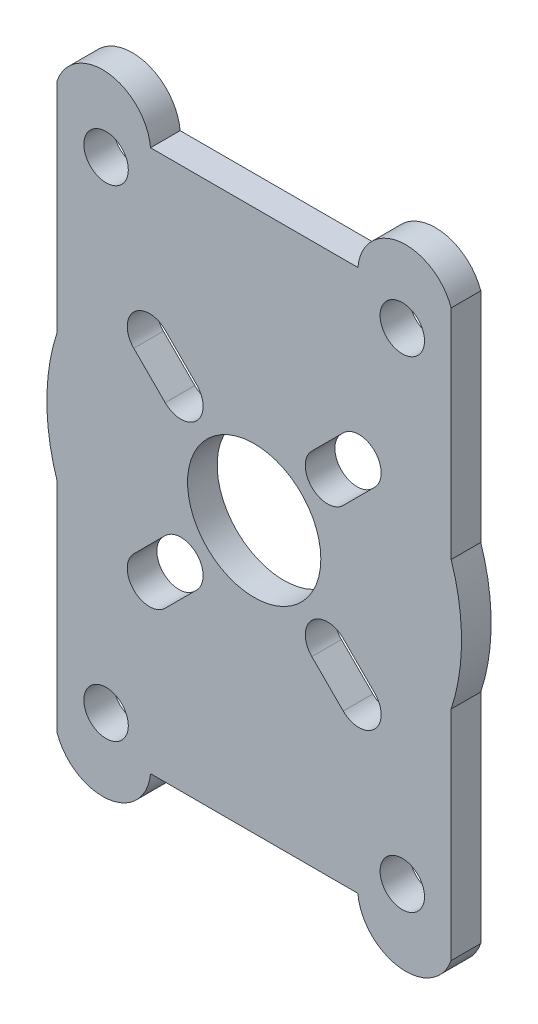
ISO-10303-21;
HEADER;
FILE_DESCRIPTION(('STEP AP214'),'2;1');
FILE_NAME('part.step','',(''),(''),'','','');
FILE_SCHEMA(('AUTOMOTIVE_DESIGN { 1 0 10303 214 1 1 1 1 }'));
ENDSEC;
DATA;
#1=APPLICATION_CONTEXT('core data for automotive mechanical design processes');
#2=APPLICATION_PROTOCOL_DEFINITION('international standard','automotive_design',2000,#1);
#3=PRODUCT_CONTEXT('',#1,'mechanical');
#4=PRODUCT('Part','Part','',(#3));
#5=PRODUCT_RELATED_PRODUCT_CATEGORY('part','',(#4));
#6=PRODUCT_DEFINITION_FORMATION('','',#4);
#7=PRODUCT_DEFINITION_CONTEXT('part definition',#1,'design');
#8=PRODUCT_DEFINITION('design','',#6,#7);
#9=PRODUCT_DEFINITION_SHAPE('','',#8);
#10=(LENGTH_UNIT() NAMED_UNIT(*) SI_UNIT(.MILLI.,.METRE.));
#11=(NAMED_UNIT(*) PLANE_ANGLE_UNIT() SI_UNIT($,.RADIAN.));
#12=(NAMED_UNIT(*) SI_UNIT($,.STERADIAN.) SOLID_ANGLE_UNIT());
#13=UNCERTAINTY_MEASURE_WITH_UNIT(LENGTH_MEASURE(1.E-05),#10,'distance_accuracy_value','');
#14=(GEOMETRIC_REPRESENTATION_CONTEXT(3) GLOBAL_UNCERTAINTY_ASSIGNED_CONTEXT((#13)) GLOBAL_UNIT_ASSIGNED_CONTEXT((#10,
#11,#12)) REPRESENTATION_CONTEXT('',''));
#15=CARTESIAN_POINT('',(0.,0.,0.));
#16=DIRECTION('',(0.,0.,1.));
#17=DIRECTION('',(1.,0.,0.));
#18=AXIS2_PLACEMENT_3D('',#15,#16,#17);
#19=CARTESIAN_POINT('',(10.2361242250569,18.,2.));
#20=DIRECTION('',(0.,0.,-1.));
#21=DIRECTION('',(-1.,0.,0.));
#22=AXIS2_PLACEMENT_3D('',#19,#20,#21);
#23=CYLINDRICAL_SURFACE('',#22,3.25);
#24=CARTESIAN_POINT('',(10.2361242250569,18.,0.));
#25=DIRECTION('',(0.,0.,1.));
#26=DIRECTION('',(-1.,0.,0.));
#27=AXIS2_PLACEMENT_3D('',#24,#25,#26);
#28=CIRCLE('',#27,3.25);
#29=CARTESIAN_POINT('',(13.3,19.0840503843072,0.));
#30=VERTEX_POINT('',#29);
#31=CARTESIAN_POINT('',(7.,18.3,0.));
#32=VERTEX_POINT('',#31);
#33=EDGE_CURVE('E377',#30,#32,#28,.T.);
#34=ORIENTED_EDGE('',*,*,#33,.T.);
#35=DIRECTION('',(0.,0.,-1.));
#36=VECTOR('',#35,1.);
#37=CARTESIAN_POINT('',(7.,18.3,2.));
#38=LINE('',#37,#36);
#39=CARTESIAN_POINT('',(7.,18.3,2.));
#40=VERTEX_POINT('',#39);
#41=EDGE_CURVE('E39',#40,#32,#38,.T.);
#42=ORIENTED_EDGE('',*,*,#41,.F.);
#43=CARTESIAN_POINT('',(10.2361242250569,18.,2.));
#44=DIRECTION('',(0.,0.,1.));
#45=DIRECTION('',(-1.,0.,0.));
#46=AXIS2_PLACEMENT_3D('',#43,#44,#45);
#47=CIRCLE('',#46,3.25);
#48=CARTESIAN_POINT('',(13.3,19.0840503843072,2.));
#49=VERTEX_POINT('',#48);
#50=EDGE_CURVE('E383',#49,#40,#47,.T.);
#51=ORIENTED_EDGE('',*,*,#50,.F.);
#52=DIRECTION('',(0.,0.,-1.));
#53=VECTOR('',#52,1.);
#54=CARTESIAN_POINT('',(13.3,19.0840503843072,2.));
#55=LINE('',#54,#53);
#56=EDGE_CURVE('E11',#49,#30,#55,.T.);
#57=ORIENTED_EDGE('',*,*,#56,.T.);
#58=EDGE_LOOP('',(#34,#42,#51,#57));
#59=FACE_BOUND('',#58,.T.);
#60=ADVANCED_FACE('F32',(#59),#23,.T.);
#61=CARTESIAN_POINT('',(-7.,18.3,2.));
#62=DIRECTION('',(0.,-1.,0.));
#63=DIRECTION('',(0.,0.,-1.));
#64=AXIS2_PLACEMENT_3D('',#61,#62,#63);
#65=PLANE('',#64);
#66=DIRECTION('',(-1.,0.,0.));
#67=VECTOR('',#66,1.);
#68=CARTESIAN_POINT('',(-7.,18.3,0.));
#69=LINE('',#68,#67);
#70=CARTESIAN_POINT('',(-7.,18.3,0.));
#71=VERTEX_POINT('',#70);
#72=EDGE_CURVE('E409',#32,#71,#69,.T.);
#73=ORIENTED_EDGE('',*,*,#72,.T.);
#74=DIRECTION('',(0.,0.,-1.));
#75=VECTOR('',#74,1.);
#76=CARTESIAN_POINT('',(-7.,18.3,2.));
#77=LINE('',#76,#75);
#78=CARTESIAN_POINT('',(-7.,18.3,2.));
#79=VERTEX_POINT('',#78);
#80=EDGE_CURVE('E459',#79,#71,#77,.T.);
#81=ORIENTED_EDGE('',*,*,#80,.F.);
#82=DIRECTION('',(-1.,0.,0.));
#83=VECTOR('',#82,1.);
#84=CARTESIAN_POINT('',(-7.,18.3,2.));
#85=LINE('',#84,#83);
#86=EDGE_CURVE('E386',#40,#79,#85,.T.);
#87=ORIENTED_EDGE('',*,*,#86,.F.);
#88=ORIENTED_EDGE('',*,*,#41,.T.);
#89=EDGE_LOOP('',(#73,#81,#87,#88));
#90=FACE_BOUND('',#89,.T.);
#91=ADVANCED_FACE('F466',(#90),#65,.F.);
#92=CARTESIAN_POINT('',(-10.2361242250569,18.,2.));
#93=DIRECTION('',(0.,0.,-1.));
#94=DIRECTION('',(-1.,0.,0.));
#95=AXIS2_PLACEMENT_3D('',#92,#93,#94);
#96=CYLINDRICAL_SURFACE('',#95,3.25);
#97=CARTESIAN_POINT('',(-10.2361242250569,18.,0.));
#98=DIRECTION('',(0.,0.,1.));
#99=DIRECTION('',(1.,0.,0.));
#100=AXIS2_PLACEMENT_3D('',#97,#98,#99);
#101=CIRCLE('',#100,3.25);
#102=CARTESIAN_POINT('',(-13.3,19.0840503843072,0.));
#103=VERTEX_POINT('',#102);
#104=EDGE_CURVE('E411',#71,#103,#101,.T.);
#105=ORIENTED_EDGE('',*,*,#104,.T.);
#106=DIRECTION('',(0.,0.,-1.));
#107=VECTOR('',#106,1.);
#108=CARTESIAN_POINT('',(-13.3,19.0840503843072,2.));
#109=LINE('',#108,#107);
#110=CARTESIAN_POINT('',(-13.3,19.0840503843072,2.));
#111=VERTEX_POINT('',#110);
#112=EDGE_CURVE('E456',#111,#103,#109,.T.);
#113=ORIENTED_EDGE('',*,*,#112,.F.);
#114=CARTESIAN_POINT('',(-10.2361242250569,18.,2.));
#115=DIRECTION('',(0.,0.,1.));
#116=DIRECTION('',(1.,0.,0.));
#117=AXIS2_PLACEMENT_3D('',#114,#115,#116);
#118=CIRCLE('',#117,3.25);
#119=EDGE_CURVE('E388',#79,#111,#118,.T.);
#120=ORIENTED_EDGE('',*,*,#119,.F.);
#121=ORIENTED_EDGE('',*,*,#80,.T.);
#122=EDGE_LOOP('',(#105,#113,#120,#121));
#123=FACE_BOUND('',#122,.T.);
#124=ADVANCED_FACE('F476',(#123),#96,.T.);
#125=CARTESIAN_POINT('',(-13.3,4.37149859887886,2.));
#126=DIRECTION('',(1.,0.,0.));
#127=DIRECTION('',(0.,0.,-1.));
#128=AXIS2_PLACEMENT_3D('',#125,#126,#127);
#129=PLANE('',#128);
#130=DIRECTION('',(0.,-1.,0.));
#131=VECTOR('',#130,1.);
#132=CARTESIAN_POINT('',(-13.3,4.37149859887886,0.));
#133=LINE('',#132,#131);
#134=CARTESIAN_POINT('',(-13.3,4.37149859887886,0.));
#135=VERTEX_POINT('',#134);
#136=EDGE_CURVE('E414',#103,#135,#133,.T.);
#137=ORIENTED_EDGE('',*,*,#136,.T.);
#138=DIRECTION('',(0.,0.,-1.));
#139=VECTOR('',#138,1.);
#140=CARTESIAN_POINT('',(-13.3,4.37149859887886,2.));
#141=LINE('',#140,#139);
#142=CARTESIAN_POINT('',(-13.3,4.37149859887886,2.));
#143=VERTEX_POINT('',#142);
#144=EDGE_CURVE('E453',#143,#135,#141,.T.);
#145=ORIENTED_EDGE('',*,*,#144,.F.);
#146=DIRECTION('',(0.,-1.,0.));
#147=VECTOR('',#146,1.);
#148=CARTESIAN_POINT('',(-13.3,18.3,2.));
#149=LINE('',#148,#147);
#150=EDGE_CURVE('E390',#111,#143,#149,.T.);
#151=ORIENTED_EDGE('',*,*,#150,.F.);
#152=ORIENTED_EDGE('',*,*,#112,.T.);
#153=EDGE_LOOP('',(#137,#145,#151,#152));
#154=FACE_BOUND('',#153,.T.);
#155=ADVANCED_FACE('F480',(#154),#129,.F.);
#156=CARTESIAN_POINT('',(0.,0.,2.));
#157=DIRECTION('',(0.,0.,-1.));
#158=DIRECTION('',(-1.,0.,0.));
#159=AXIS2_PLACEMENT_3D('',#156,#157,#158);
#160=CYLINDRICAL_SURFACE('',#159,14.);
#161=CARTESIAN_POINT('',(0.,0.,0.));
#162=DIRECTION('',(0.,0.,1.));
#163=DIRECTION('',(1.,0.,0.));
#164=AXIS2_PLACEMENT_3D('',#161,#162,#163);
#165=CIRCLE('',#164,14.);
#166=CARTESIAN_POINT('',(-13.3,-4.37149859887887,0.));
#167=VERTEX_POINT('',#166);
#168=EDGE_CURVE('E416',#135,#167,#165,.T.);
#169=ORIENTED_EDGE('',*,*,#168,.T.);
#170=DIRECTION('',(0.,0.,-1.));
#171=VECTOR('',#170,1.);
#172=CARTESIAN_POINT('',(-13.3,-4.37149859887887,2.));
#173=LINE('',#172,#171);
#174=CARTESIAN_POINT('',(-13.3,-4.37149859887887,2.));
#175=VERTEX_POINT('',#174);
#176=EDGE_CURVE('E450',#175,#167,#173,.T.);
#177=ORIENTED_EDGE('',*,*,#176,.F.);
#178=CARTESIAN_POINT('',(0.,0.,2.));
#179=DIRECTION('',(0.,0.,1.));
#180=DIRECTION('',(1.,0.,0.));
#181=AXIS2_PLACEMENT_3D('',#178,#179,#180);
#182=CIRCLE('',#181,14.);
#183=EDGE_CURVE('E392',#143,#175,#182,.T.);
#184=ORIENTED_EDGE('',*,*,#183,.F.);
#185=ORIENTED_EDGE('',*,*,#144,.T.);
#186=EDGE_LOOP('',(#169,#177,#184,#185));
#187=FACE_BOUND('',#186,.T.);
#188=ADVANCED_FACE('F518',(#187),#160,.T.);
#189=CARTESIAN_POINT('',(-13.3,-18.3,2.));
#190=DIRECTION('',(1.,0.,0.));
#191=DIRECTION('',(0.,0.,-1.));
#192=AXIS2_PLACEMENT_3D('',#189,#190,#191);
#193=PLANE('',#192);
#194=DIRECTION('',(0.,-1.,0.));
#195=VECTOR('',#194,1.);
#196=CARTESIAN_POINT('',(-13.3,-18.3,0.));
#197=LINE('',#196,#195);
#198=CARTESIAN_POINT('',(-13.3,-19.0840503843072,0.));
#199=VERTEX_POINT('',#198);
#200=EDGE_CURVE('E419',#167,#199,#197,.T.);
#201=ORIENTED_EDGE('',*,*,#200,.T.);
#202=DIRECTION('',(0.,0.,-1.));
#203=VECTOR('',#202,1.);
#204=CARTESIAN_POINT('',(-13.3,-19.0840503843072,2.));
#205=LINE('',#204,#203);
#206=CARTESIAN_POINT('',(-13.3,-19.0840503843072,2.));
#207=VERTEX_POINT('',#206);
#208=EDGE_CURVE('E447',#207,#199,#205,.T.);
#209=ORIENTED_EDGE('',*,*,#208,.F.);
#210=DIRECTION('',(0.,-1.,0.));
#211=VECTOR('',#210,1.);
#212=CARTESIAN_POINT('',(-13.3,-18.3,2.));
#213=LINE('',#212,#211);
#214=EDGE_CURVE('E394',#175,#207,#213,.T.);
#215=ORIENTED_EDGE('',*,*,#214,.F.);
#216=ORIENTED_EDGE('',*,*,#176,.T.);
#217=EDGE_LOOP('',(#201,#209,#215,#216));
#218=FACE_BOUND('',#217,.T.);
#219=ADVANCED_FACE('F516',(#218),#193,.F.);
#220=CARTESIAN_POINT('',(-10.2361242250569,-18.,2.));
#221=DIRECTION('',(0.,0.,-1.));
#222=DIRECTION('',(-1.,0.,0.));
#223=AXIS2_PLACEMENT_3D('',#220,#221,#222);
#224=CYLINDRICAL_SURFACE('',#223,3.25);
#225=CARTESIAN_POINT('',(-10.2361242250569,-18.,0.));
#226=DIRECTION('',(0.,0.,1.));
#227=DIRECTION('',(-1.,0.,0.));
#228=AXIS2_PLACEMENT_3D('',#225,#226,#227);
#229=CIRCLE('',#228,3.25);
#230=CARTESIAN_POINT('',(-7.,-18.3,0.));
#231=VERTEX_POINT('',#230);
#232=EDGE_CURVE('E421',#199,#231,#229,.T.);
#233=ORIENTED_EDGE('',*,*,#232,.T.);
#234=DIRECTION('',(0.,0.,-1.));
#235=VECTOR('',#234,1.);
#236=CARTESIAN_POINT('',(-7.,-18.3,2.));
#237=LINE('',#236,#235);
#238=CARTESIAN_POINT('',(-7.,-18.3,2.));
#239=VERTEX_POINT('',#238);
#240=EDGE_CURVE('E444',#239,#231,#237,.T.);
#241=ORIENTED_EDGE('',*,*,#240,.F.);
#242=CARTESIAN_POINT('',(-10.2361242250569,-18.,2.));
#243=DIRECTION('',(0.,0.,1.));
#244=DIRECTION('',(-1.,0.,0.));
#245=AXIS2_PLACEMENT_3D('',#242,#243,#244);
#246=CIRCLE('',#245,3.25);
#247=EDGE_CURVE('E396',#207,#239,#246,.T.);
#248=ORIENTED_EDGE('',*,*,#247,.F.);
#249=ORIENTED_EDGE('',*,*,#208,.T.);
#250=EDGE_LOOP('',(#233,#241,#248,#249));
#251=FACE_BOUND('',#250,.T.);
#252=ADVANCED_FACE('F512',(#251),#224,.T.);
#253=CARTESIAN_POINT('',(-7.,-18.3,2.));
#254=DIRECTION('',(0.,1.,0.));
#255=DIRECTION('',(0.,0.,1.));
#256=AXIS2_PLACEMENT_3D('',#253,#254,#255);
#257=PLANE('',#256);
#258=DIRECTION('',(1.,0.,0.));
#259=VECTOR('',#258,1.);
#260=CARTESIAN_POINT('',(-7.,-18.3,0.));
#261=LINE('',#260,#259);
#262=CARTESIAN_POINT('',(7.,-18.3,0.));
#263=VERTEX_POINT('',#262);
#264=EDGE_CURVE('E423',#231,#263,#261,.T.);
#265=ORIENTED_EDGE('',*,*,#264,.T.);
#266=DIRECTION('',(0.,0.,-1.));
#267=VECTOR('',#266,1.);
#268=CARTESIAN_POINT('',(7.,-18.3,2.));
#269=LINE('',#268,#267);
#270=CARTESIAN_POINT('',(7.,-18.3,2.));
#271=VERTEX_POINT('',#270);
#272=EDGE_CURVE('E441',#271,#263,#269,.T.);
#273=ORIENTED_EDGE('',*,*,#272,.F.);
#274=DIRECTION('',(1.,0.,0.));
#275=VECTOR('',#274,1.);
#276=CARTESIAN_POINT('',(-7.,-18.3,2.));
#277=LINE('',#276,#275);
#278=EDGE_CURVE('E398',#239,#271,#277,.T.);
#279=ORIENTED_EDGE('',*,*,#278,.F.);
#280=ORIENTED_EDGE('',*,*,#240,.T.);
#281=EDGE_LOOP('',(#265,#273,#279,#280));
#282=FACE_BOUND('',#281,.T.);
#283=ADVANCED_FACE('F507',(#282),#257,.F.);
#284=CARTESIAN_POINT('',(10.2361242250569,-18.,2.));
#285=DIRECTION('',(0.,0.,-1.));
#286=DIRECTION('',(-1.,0.,0.));
#287=AXIS2_PLACEMENT_3D('',#284,#285,#286);
#288=CYLINDRICAL_SURFACE('',#287,3.25);
#289=CARTESIAN_POINT('',(10.2361242250569,-18.,0.));
#290=DIRECTION('',(0.,0.,1.));
#291=DIRECTION('',(1.,0.,0.));
#292=AXIS2_PLACEMENT_3D('',#289,#290,#291);
#293=CIRCLE('',#292,3.25);
#294=CARTESIAN_POINT('',(13.3,-19.0840503843072,0.));
#295=VERTEX_POINT('',#294);
#296=EDGE_CURVE('E425',#263,#295,#293,.T.);
#297=ORIENTED_EDGE('',*,*,#296,.T.);
#298=DIRECTION('',(0.,0.,-1.));
#299=VECTOR('',#298,1.);
#300=CARTESIAN_POINT('',(13.3,-19.0840503843072,2.));
#301=LINE('',#300,#299);
#302=CARTESIAN_POINT('',(13.3,-19.0840503843072,2.));
#303=VERTEX_POINT('',#302);
#304=EDGE_CURVE('E438',#303,#295,#301,.T.);
#305=ORIENTED_EDGE('',*,*,#304,.F.);
#306=CARTESIAN_POINT('',(10.2361242250569,-18.,2.));
#307=DIRECTION('',(0.,0.,1.));
#308=DIRECTION('',(1.,0.,0.));
#309=AXIS2_PLACEMENT_3D('',#306,#307,#308);
#310=CIRCLE('',#309,3.25);
#311=EDGE_CURVE('E400',#271,#303,#310,.T.);
#312=ORIENTED_EDGE('',*,*,#311,.F.);
#313=ORIENTED_EDGE('',*,*,#272,.T.);
#314=EDGE_LOOP('',(#297,#305,#312,#313));
#315=FACE_BOUND('',#314,.T.);
#316=ADVANCED_FACE('F502',(#315),#288,.T.);
#317=CARTESIAN_POINT('',(13.3,-18.3,2.));
#318=DIRECTION('',(-1.,0.,0.));
#319=DIRECTION('',(0.,0.,1.));
#320=AXIS2_PLACEMENT_3D('',#317,#318,#319);
#321=PLANE('',#320);
#322=DIRECTION('',(0.,1.,0.));
#323=VECTOR('',#322,1.);
#324=CARTESIAN_POINT('',(13.3,-18.3,0.));
#325=LINE('',#324,#323);
#326=CARTESIAN_POINT('',(13.3,-4.3714985988789,0.));
#327=VERTEX_POINT('',#326);
#328=EDGE_CURVE('E428',#295,#327,#325,.T.);
#329=ORIENTED_EDGE('',*,*,#328,.T.);
#330=DIRECTION('',(0.,0.,-1.));
#331=VECTOR('',#330,1.);
#332=CARTESIAN_POINT('',(13.3,-4.3714985988789,2.));
#333=LINE('',#332,#331);
#334=CARTESIAN_POINT('',(13.3,-4.3714985988789,2.));
#335=VERTEX_POINT('',#334);
#336=EDGE_CURVE('E435',#335,#327,#333,.T.);
#337=ORIENTED_EDGE('',*,*,#336,.F.);
#338=DIRECTION('',(0.,1.,0.));
#339=VECTOR('',#338,1.);
#340=CARTESIAN_POINT('',(13.3,-18.3,2.));
#341=LINE('',#340,#339);
#342=EDGE_CURVE('E402',#303,#335,#341,.T.);
#343=ORIENTED_EDGE('',*,*,#342,.F.);
#344=ORIENTED_EDGE('',*,*,#304,.T.);
#345=EDGE_LOOP('',(#329,#337,#343,#344));
#346=FACE_BOUND('',#345,.T.);
#347=ADVANCED_FACE('F498',(#346),#321,.F.);
#348=CARTESIAN_POINT('',(0.,0.,2.));
#349=DIRECTION('',(0.,0.,-1.));
#350=DIRECTION('',(-1.,0.,0.));
#351=AXIS2_PLACEMENT_3D('',#348,#349,#350);
#352=CYLINDRICAL_SURFACE('',#351,14.);
#353=CARTESIAN_POINT('',(0.,0.,0.));
#354=DIRECTION('',(0.,0.,1.));
#355=DIRECTION('',(1.,0.,0.));
#356=AXIS2_PLACEMENT_3D('',#353,#354,#355);
#357=CIRCLE('',#356,14.);
#358=CARTESIAN_POINT('',(13.3,4.37149859887889,0.));
#359=VERTEX_POINT('',#358);
#360=EDGE_CURVE('E430',#327,#359,#357,.T.);
#361=ORIENTED_EDGE('',*,*,#360,.T.);
#362=DIRECTION('',(0.,0.,-1.));
#363=VECTOR('',#362,1.);
#364=CARTESIAN_POINT('',(13.3,4.37149859887889,2.));
#365=LINE('',#364,#363);
#366=CARTESIAN_POINT('',(13.3,4.37149859887889,2.));
#367=VERTEX_POINT('',#366);
#368=EDGE_CURVE('E407',#367,#359,#365,.T.);
#369=ORIENTED_EDGE('',*,*,#368,.F.);
#370=CARTESIAN_POINT('',(0.,0.,2.));
#371=DIRECTION('',(0.,0.,1.));
#372=DIRECTION('',(1.,0.,0.));
#373=AXIS2_PLACEMENT_3D('',#370,#371,#372);
#374=CIRCLE('',#373,14.);
#375=EDGE_CURVE('E404',#335,#367,#374,.T.);
#376=ORIENTED_EDGE('',*,*,#375,.F.);
#377=ORIENTED_EDGE('',*,*,#336,.T.);
#378=EDGE_LOOP('',(#361,#369,#376,#377));
#379=FACE_BOUND('',#378,.T.);
#380=ADVANCED_FACE('F493',(#379),#352,.T.);
#381=CARTESIAN_POINT('',(13.3,4.37149859887889,2.));
#382=DIRECTION('',(-1.,0.,0.));
#383=DIRECTION('',(0.,0.,1.));
#384=AXIS2_PLACEMENT_3D('',#381,#382,#383);
#385=PLANE('',#384);
#386=DIRECTION('',(0.,1.,0.));
#387=VECTOR('',#386,1.);
#388=CARTESIAN_POINT('',(13.3,4.37149859887889,0.));
#389=LINE('',#388,#387);
#390=EDGE_CURVE('E384',#359,#30,#389,.T.);
#391=ORIENTED_EDGE('',*,*,#390,.T.);
#392=ORIENTED_EDGE('',*,*,#56,.F.);
#393=DIRECTION('',(0.,1.,0.));
#394=VECTOR('',#393,1.);
#395=CARTESIAN_POINT('',(13.3,18.3,2.));
#396=LINE('',#395,#394);
#397=EDGE_CURVE('E380',#367,#49,#396,.T.);
#398=ORIENTED_EDGE('',*,*,#397,.F.);
#399=ORIENTED_EDGE('',*,*,#368,.T.);
#400=EDGE_LOOP('',(#391,#392,#398,#399));
#401=FACE_BOUND('',#400,.T.);
#402=ADVANCED_FACE('F488',(#401),#385,.F.);
#403=CARTESIAN_POINT('',(10.2361242250569,18.,2.));
#404=DIRECTION('',(0.,0.,-1.));
#405=DIRECTION('',(-1.,0.,0.));
#406=AXIS2_PLACEMENT_3D('',#403,#404,#405);
#407=PLANE('',#406);
#408=CARTESIAN_POINT('',(-10.,16.25,2.));
#409=DIRECTION('',(0.,0.,1.));
#410=DIRECTION('',(1.,0.,0.));
#411=AXIS2_PLACEMENT_3D('',#408,#409,#410);
#412=CIRCLE('',#411,1.5);
#413=CARTESIAN_POINT('',(-8.5,16.25,2.));
#414=VERTEX_POINT('',#413);
#415=EDGE_CURVE('E354',#414,#414,#412,.T.);
#416=ORIENTED_EDGE('',*,*,#415,.F.);
#417=EDGE_LOOP('',(#416));
#418=FACE_BOUND('',#417,.T.);
#419=CARTESIAN_POINT('',(10.,16.25,2.));
#420=DIRECTION('',(0.,0.,1.));
#421=DIRECTION('',(1.,0.,0.));
#422=AXIS2_PLACEMENT_3D('',#419,#420,#421);
#423=CIRCLE('',#422,1.5);
#424=CARTESIAN_POINT('',(11.5,16.25,2.));
#425=VERTEX_POINT('',#424);
#426=EDGE_CURVE('E360',#425,#425,#423,.T.);
#427=ORIENTED_EDGE('',*,*,#426,.F.);
#428=EDGE_LOOP('',(#427));
#429=FACE_BOUND('',#428,.T.);
#430=CARTESIAN_POINT('',(-10.,-16.25,2.));
#431=DIRECTION('',(0.,0.,1.));
#432=DIRECTION('',(1.,0.,0.));
#433=AXIS2_PLACEMENT_3D('',#430,#431,#432);
#434=CIRCLE('',#433,1.5);
#435=CARTESIAN_POINT('',(-8.5,-16.25,2.));
#436=VERTEX_POINT('',#435);
#437=EDGE_CURVE('E366',#436,#436,#434,.T.);
#438=ORIENTED_EDGE('',*,*,#437,.F.);
#439=EDGE_LOOP('',(#438));
#440=FACE_BOUND('',#439,.T.);
#441=CARTESIAN_POINT('',(10.,-16.25,2.));
#442=DIRECTION('',(0.,0.,1.));
#443=DIRECTION('',(1.,0.,0.));
#444=AXIS2_PLACEMENT_3D('',#441,#442,#443);
#445=CIRCLE('',#444,1.5);
#446=CARTESIAN_POINT('',(11.5,-16.25,2.));
#447=VERTEX_POINT('',#446);
#448=EDGE_CURVE('E253',#447,#447,#445,.T.);
#449=ORIENTED_EDGE('',*,*,#448,.F.);
#450=EDGE_LOOP('',(#449));
#451=FACE_BOUND('',#450,.T.);
#452=DIRECTION('',(0.707106781186546,0.707106781186549,0.));
#453=VECTOR('',#452,1.);
#454=CARTESIAN_POINT('',(6.01040764008565,3.88908729652602,2.));
#455=LINE('',#454,#453);
#456=CARTESIAN_POINT('',(6.01040764008565,3.88908729652602,2.));
#457=VERTEX_POINT('',#456);
#458=CARTESIAN_POINT('',(8.13172798364528,6.01040764008567,2.));
#459=VERTEX_POINT('',#458);
#460=EDGE_CURVE('E246',#457,#459,#455,.T.);
#461=ORIENTED_EDGE('',*,*,#460,.F.);
#462=CARTESIAN_POINT('',(4.94974746830582,4.94974746830584,2.));
#463=DIRECTION('',(0.,0.,1.));
#464=DIRECTION('',(1.,0.,0.));
#465=AXIS2_PLACEMENT_3D('',#462,#463,#464);
#466=CIRCLE('',#465,1.5);
#467=CARTESIAN_POINT('',(3.889087296526,6.01040764008566,2.));
#468=VERTEX_POINT('',#467);
#469=EDGE_CURVE('E46',#468,#457,#466,.T.);
#470=ORIENTED_EDGE('',*,*,#469,.F.);
#471=DIRECTION('',(-0.707106781186546,-0.707106781186549,0.));
#472=VECTOR('',#471,1.);
#473=CARTESIAN_POINT('',(3.889087296526,6.01040764008566,2.));
#474=LINE('',#473,#472);
#475=CARTESIAN_POINT('',(6.01040764008564,8.13172798364531,2.));
#476=VERTEX_POINT('',#475);
#477=EDGE_CURVE('E237',#476,#468,#474,.T.);
#478=ORIENTED_EDGE('',*,*,#477,.F.);
#479=CARTESIAN_POINT('',(7.07106781186546,7.07106781186549,2.));
#480=DIRECTION('',(0.,0.,1.));
#481=DIRECTION('',(1.,0.,0.));
#482=AXIS2_PLACEMENT_3D('',#479,#480,#481);
#483=CIRCLE('',#482,1.5);
#484=EDGE_CURVE('E240',#459,#476,#483,.T.);
#485=ORIENTED_EDGE('',*,*,#484,.F.);
#486=EDGE_LOOP('',(#461,#470,#478,#485));
#487=FACE_BOUND('',#486,.T.);
#488=DIRECTION('',(0.707106781186546,-0.707106781186549,0.));
#489=VECTOR('',#488,1.);
#490=CARTESIAN_POINT('',(3.889087296526,-6.01040764008566,2.));
#491=LINE('',#490,#489);
#492=CARTESIAN_POINT('',(3.88908729652601,-6.01040764008566,2.));
#493=VERTEX_POINT('',#492);
#494=CARTESIAN_POINT('',(6.01040764008564,-8.1317279836453,2.));
#495=VERTEX_POINT('',#494);
#496=EDGE_CURVE('E272',#493,#495,#491,.T.);
#497=ORIENTED_EDGE('',*,*,#496,.F.);
#498=CARTESIAN_POINT('',(4.94974746830583,-4.94974746830584,2.));
#499=DIRECTION('',(0.,0.,1.));
#500=DIRECTION('',(1.,0.,0.));
#501=AXIS2_PLACEMENT_3D('',#498,#499,#500);
#502=CIRCLE('',#501,1.5);
#503=CARTESIAN_POINT('',(6.01040764008565,-3.88908729652602,2.));
#504=VERTEX_POINT('',#503);
#505=EDGE_CURVE('E54',#504,#493,#502,.T.);
#506=ORIENTED_EDGE('',*,*,#505,.F.);
#507=DIRECTION('',(-0.707106781186546,0.707106781186549,0.));
#508=VECTOR('',#507,1.);
#509=CARTESIAN_POINT('',(6.01040764008565,-3.88908729652602,2.));
#510=LINE('',#509,#508);
#511=CARTESIAN_POINT('',(8.13172798364529,-6.01040764008567,2.));
#512=VERTEX_POINT('',#511);
#513=EDGE_CURVE('E261',#512,#504,#510,.T.);
#514=ORIENTED_EDGE('',*,*,#513,.F.);
#515=CARTESIAN_POINT('',(7.07106781186546,-7.07106781186549,2.));
#516=DIRECTION('',(0.,0.,1.));
#517=DIRECTION('',(1.,0.,0.));
#518=AXIS2_PLACEMENT_3D('',#515,#516,#517);
#519=CIRCLE('',#518,1.5);
#520=EDGE_CURVE('E276',#495,#512,#519,.T.);
#521=ORIENTED_EDGE('',*,*,#520,.F.);
#522=EDGE_LOOP('',(#497,#506,#514,#521));
#523=FACE_BOUND('',#522,.T.);
#524=DIRECTION('',(-0.707106781186546,-0.707106781186549,0.));
#525=VECTOR('',#524,1.);
#526=CARTESIAN_POINT('',(-6.01040764008537,-3.8890872965263,2.));
#527=LINE('',#526,#525);
#528=CARTESIAN_POINT('',(-6.01040764008537,-3.8890872965263,2.));
#529=VERTEX_POINT('',#528);
#530=CARTESIAN_POINT('',(-8.13172798364501,-6.01040764008595,2.));
#531=VERTEX_POINT('',#530);
#532=EDGE_CURVE('E303',#529,#531,#527,.T.);
#533=ORIENTED_EDGE('',*,*,#532,.F.);
#534=CARTESIAN_POINT('',(-4.94974746830555,-4.94974746830612,2.));
#535=DIRECTION('',(0.,0.,1.));
#536=DIRECTION('',(1.,0.,0.));
#537=AXIS2_PLACEMENT_3D('',#534,#535,#536);
#538=CIRCLE('',#537,1.5);
#539=CARTESIAN_POINT('',(-3.88908729652572,-6.01040764008594,2.));
#540=VERTEX_POINT('',#539);
#541=EDGE_CURVE('E301',#540,#529,#538,.T.);
#542=ORIENTED_EDGE('',*,*,#541,.F.);
#543=DIRECTION('',(0.707106781186546,0.707106781186549,0.));
#544=VECTOR('',#543,1.);
#545=CARTESIAN_POINT('',(-3.88908729652572,-6.01040764008594,2.));
#546=LINE('',#545,#544);
#547=CARTESIAN_POINT('',(-6.01040764008536,-8.13172798364559,2.));
#548=VERTEX_POINT('',#547);
#549=EDGE_CURVE('E291',#548,#540,#546,.T.);
#550=ORIENTED_EDGE('',*,*,#549,.F.);
#551=CARTESIAN_POINT('',(-7.07106781186518,-7.07106781186577,2.));
#552=DIRECTION('',(0.,0.,1.));
#553=DIRECTION('',(1.,0.,0.));
#554=AXIS2_PLACEMENT_3D('',#551,#552,#553);
#555=CIRCLE('',#554,1.5);
#556=EDGE_CURVE('E307',#531,#548,#555,.T.);
#557=ORIENTED_EDGE('',*,*,#556,.F.);
#558=EDGE_LOOP('',(#533,#542,#550,#557));
#559=FACE_BOUND('',#558,.T.);
#560=DIRECTION('',(-0.707106781186542,0.707106781186553,0.));
#561=VECTOR('',#560,1.);
#562=CARTESIAN_POINT('',(-3.88908729652596,6.01040764008569,2.));
#563=LINE('',#562,#561);
#564=CARTESIAN_POINT('',(-3.88908729652596,6.01040764008569,2.));
#565=VERTEX_POINT('',#564);
#566=CARTESIAN_POINT('',(-6.01040764008558,8.13172798364535,2.));
#567=VERTEX_POINT('',#566);
#568=EDGE_CURVE('E335',#565,#567,#563,.T.);
#569=ORIENTED_EDGE('',*,*,#568,.F.);
#570=CARTESIAN_POINT('',(-4.94974746830579,4.94974746830587,2.));
#571=DIRECTION('',(0.,0.,1.));
#572=DIRECTION('',(1.,0.,0.));
#573=AXIS2_PLACEMENT_3D('',#570,#571,#572);
#574=CIRCLE('',#573,1.5);
#575=CARTESIAN_POINT('',(-6.01040764008562,3.88908729652606,2.));
#576=VERTEX_POINT('',#575);
#577=EDGE_CURVE('E333',#576,#565,#574,.T.);
#578=ORIENTED_EDGE('',*,*,#577,.F.);
#579=DIRECTION('',(0.707106781186541,-0.707106781186554,0.));
#580=VECTOR('',#579,1.);
#581=CARTESIAN_POINT('',(-6.01040764008562,3.88908729652606,2.));
#582=LINE('',#581,#580);
#583=CARTESIAN_POINT('',(-8.13172798364524,6.01040764008572,2.));
#584=VERTEX_POINT('',#583);
#585=EDGE_CURVE('E323',#584,#576,#582,.T.);
#586=ORIENTED_EDGE('',*,*,#585,.F.);
#587=CARTESIAN_POINT('',(-7.07106781186541,7.07106781186553,2.));
#588=DIRECTION('',(0.,0.,1.));
#589=DIRECTION('',(1.,0.,0.));
#590=AXIS2_PLACEMENT_3D('',#587,#588,#589);
#591=CIRCLE('',#590,1.5);
#592=EDGE_CURVE('E338',#567,#584,#591,.T.);
#593=ORIENTED_EDGE('',*,*,#592,.F.);
#594=EDGE_LOOP('',(#569,#578,#586,#593));
#595=FACE_BOUND('',#594,.T.);
#596=CARTESIAN_POINT('',(0.,0.,2.));
#597=DIRECTION('',(0.,0.,1.));
#598=DIRECTION('',(1.,0.,0.));
#599=AXIS2_PLACEMENT_3D('',#596,#597,#598);
#600=CIRCLE('',#599,4.5);
#601=CARTESIAN_POINT('',(4.5,0.,2.));
#602=VERTEX_POINT('',#601);
#603=EDGE_CURVE('E353',#602,#602,#600,.T.);
#604=ORIENTED_EDGE('',*,*,#603,.F.);
#605=EDGE_LOOP('',(#604));
#606=FACE_BOUND('',#605,.T.);
#607=ORIENTED_EDGE('',*,*,#397,.T.);
#608=ORIENTED_EDGE('',*,*,#50,.T.);
#609=ORIENTED_EDGE('',*,*,#86,.T.);
#610=ORIENTED_EDGE('',*,*,#119,.T.);
#611=ORIENTED_EDGE('',*,*,#150,.T.);
#612=ORIENTED_EDGE('',*,*,#183,.T.);
#613=ORIENTED_EDGE('',*,*,#214,.T.);
#614=ORIENTED_EDGE('',*,*,#247,.T.);
#615=ORIENTED_EDGE('',*,*,#278,.T.);
#616=ORIENTED_EDGE('',*,*,#311,.T.);
#617=ORIENTED_EDGE('',*,*,#342,.T.);
#618=ORIENTED_EDGE('',*,*,#375,.T.);
#619=EDGE_LOOP('',(#607,#608,#609,#610,#611,#612,#613,#614,#615,#616,#617,#618));
#620=FACE_BOUND('',#619,.T.);
#621=ADVANCED_FACE('F484',(#418,#429,#440,#451,#487,#523,#559,#595,#606,#620),#407,.F.);
#622=CARTESIAN_POINT('',(10.2361242250569,18.,0.));
#623=DIRECTION('',(0.,0.,-1.));
#624=DIRECTION('',(-1.,0.,0.));
#625=AXIS2_PLACEMENT_3D('',#622,#623,#624);
#626=PLANE('',#625);
#627=CARTESIAN_POINT('',(-10.,16.25,0.));
#628=DIRECTION('',(0.,0.,1.));
#629=DIRECTION('',(1.,0.,0.));
#630=AXIS2_PLACEMENT_3D('',#627,#628,#629);
#631=CIRCLE('',#630,1.5);
#632=CARTESIAN_POINT('',(-8.5,16.25,0.));
#633=VERTEX_POINT('',#632);
#634=EDGE_CURVE('E350',#633,#633,#631,.T.);
#635=ORIENTED_EDGE('',*,*,#634,.T.);
#636=EDGE_LOOP('',(#635));
#637=FACE_BOUND('',#636,.T.);
#638=CARTESIAN_POINT('',(10.,16.25,0.));
#639=DIRECTION('',(0.,0.,1.));
#640=DIRECTION('',(1.,0.,0.));
#641=AXIS2_PLACEMENT_3D('',#638,#639,#640);
#642=CIRCLE('',#641,1.5);
#643=CARTESIAN_POINT('',(11.5,16.25,0.));
#644=VERTEX_POINT('',#643);
#645=EDGE_CURVE('E357',#644,#644,#642,.T.);
#646=ORIENTED_EDGE('',*,*,#645,.T.);
#647=EDGE_LOOP('',(#646));
#648=FACE_BOUND('',#647,.T.);
#649=CARTESIAN_POINT('',(-10.,-16.25,0.));
#650=DIRECTION('',(0.,0.,1.));
#651=DIRECTION('',(1.,0.,0.));
#652=AXIS2_PLACEMENT_3D('',#649,#650,#651);
#653=CIRCLE('',#652,1.5);
#654=CARTESIAN_POINT('',(-8.5,-16.25,0.));
#655=VERTEX_POINT('',#654);
#656=EDGE_CURVE('E363',#655,#655,#653,.T.);
#657=ORIENTED_EDGE('',*,*,#656,.T.);
#658=EDGE_LOOP('',(#657));
#659=FACE_BOUND('',#658,.T.);
#660=CARTESIAN_POINT('',(10.,-16.25,0.));
#661=DIRECTION('',(0.,0.,1.));
#662=DIRECTION('',(1.,0.,0.));
#663=AXIS2_PLACEMENT_3D('',#660,#661,#662);
#664=CIRCLE('',#663,1.5);
#665=CARTESIAN_POINT('',(11.5,-16.25,0.));
#666=VERTEX_POINT('',#665);
#667=EDGE_CURVE('E369',#666,#666,#664,.T.);
#668=ORIENTED_EDGE('',*,*,#667,.T.);
#669=EDGE_LOOP('',(#668));
#670=FACE_BOUND('',#669,.T.);
#671=CARTESIAN_POINT('',(4.94974746830582,4.94974746830584,0.));
#672=DIRECTION('',(0.,0.,1.));
#673=DIRECTION('',(1.,0.,0.));
#674=AXIS2_PLACEMENT_3D('',#671,#672,#673);
#675=CIRCLE('',#674,1.5);
#676=CARTESIAN_POINT('',(3.889087296526,6.01040764008566,0.));
#677=VERTEX_POINT('',#676);
#678=CARTESIAN_POINT('',(6.01040764008565,3.88908729652602,0.));
#679=VERTEX_POINT('',#678);
#680=EDGE_CURVE('E218',#677,#679,#675,.T.);
#681=ORIENTED_EDGE('',*,*,#680,.T.);
#682=DIRECTION('',(0.707106781186546,0.707106781186549,0.));
#683=VECTOR('',#682,1.);
#684=CARTESIAN_POINT('',(6.01040764008565,3.88908729652602,0.));
#685=LINE('',#684,#683);
#686=CARTESIAN_POINT('',(8.13172798364528,6.01040764008567,0.));
#687=VERTEX_POINT('',#686);
#688=EDGE_CURVE('E228',#679,#687,#685,.T.);
#689=ORIENTED_EDGE('',*,*,#688,.T.);
#690=CARTESIAN_POINT('',(7.07106781186546,7.07106781186549,0.));
#691=DIRECTION('',(0.,0.,1.));
#692=DIRECTION('',(1.,0.,0.));
#693=AXIS2_PLACEMENT_3D('',#690,#691,#692);
#694=CIRCLE('',#693,1.5);
#695=CARTESIAN_POINT('',(6.01040764008564,8.13172798364531,0.));
#696=VERTEX_POINT('',#695);
#697=EDGE_CURVE('E232',#687,#696,#694,.T.);
#698=ORIENTED_EDGE('',*,*,#697,.T.);
#699=DIRECTION('',(-0.707106781186546,-0.707106781186549,0.));
#700=VECTOR('',#699,1.);
#701=CARTESIAN_POINT('',(3.889087296526,6.01040764008566,0.));
#702=LINE('',#701,#700);
#703=EDGE_CURVE('E224',#696,#677,#702,.T.);
#704=ORIENTED_EDGE('',*,*,#703,.T.);
#705=EDGE_LOOP('',(#681,#689,#698,#704));
#706=FACE_BOUND('',#705,.T.);
#707=CARTESIAN_POINT('',(4.94974746830583,-4.94974746830584,0.));
#708=DIRECTION('',(0.,0.,1.));
#709=DIRECTION('',(1.,0.,0.));
#710=AXIS2_PLACEMENT_3D('',#707,#708,#709);
#711=CIRCLE('',#710,1.5);
#712=CARTESIAN_POINT('',(6.01040764008565,-3.88908729652602,0.));
#713=VERTEX_POINT('',#712);
#714=CARTESIAN_POINT('',(3.889087296526,-6.01040764008566,0.));
#715=VERTEX_POINT('',#714);
#716=EDGE_CURVE('E257',#713,#715,#711,.T.);
#717=ORIENTED_EDGE('',*,*,#716,.T.);
#718=DIRECTION('',(0.707106781186546,-0.707106781186549,0.));
#719=VECTOR('',#718,1.);
#720=CARTESIAN_POINT('',(3.889087296526,-6.01040764008566,0.));
#721=LINE('',#720,#719);
#722=CARTESIAN_POINT('',(6.01040764008564,-8.1317279836453,0.));
#723=VERTEX_POINT('',#722);
#724=EDGE_CURVE('E260',#715,#723,#721,.T.);
#725=ORIENTED_EDGE('',*,*,#724,.T.);
#726=CARTESIAN_POINT('',(7.07106781186546,-7.07106781186549,0.));
#727=DIRECTION('',(0.,0.,1.));
#728=DIRECTION('',(1.,0.,0.));
#729=AXIS2_PLACEMENT_3D('',#726,#727,#728);
#730=CIRCLE('',#729,1.5);
#731=CARTESIAN_POINT('',(8.13172798364529,-6.01040764008567,0.));
#732=VERTEX_POINT('',#731);
#733=EDGE_CURVE('E264',#723,#732,#730,.T.);
#734=ORIENTED_EDGE('',*,*,#733,.T.);
#735=DIRECTION('',(-0.707106781186546,0.707106781186549,0.));
#736=VECTOR('',#735,1.);
#737=CARTESIAN_POINT('',(6.01040764008565,-3.88908729652602,0.));
#738=LINE('',#737,#736);
#739=EDGE_CURVE('E267',#732,#713,#738,.T.);
#740=ORIENTED_EDGE('',*,*,#739,.T.);
#741=EDGE_LOOP('',(#717,#725,#734,#740));
#742=FACE_BOUND('',#741,.T.);
#743=CARTESIAN_POINT('',(-4.94974746830555,-4.94974746830612,0.));
#744=DIRECTION('',(0.,0.,1.));
#745=DIRECTION('',(1.,0.,0.));
#746=AXIS2_PLACEMENT_3D('',#743,#744,#745);
#747=CIRCLE('',#746,1.5);
#748=CARTESIAN_POINT('',(-3.88908729652572,-6.01040764008594,0.));
#749=VERTEX_POINT('',#748);
#750=CARTESIAN_POINT('',(-6.01040764008537,-3.8890872965263,0.));
#751=VERTEX_POINT('',#750);
#752=EDGE_CURVE('E287',#749,#751,#747,.T.);
#753=ORIENTED_EDGE('',*,*,#752,.T.);
#754=DIRECTION('',(-0.707106781186546,-0.707106781186549,0.));
#755=VECTOR('',#754,1.);
#756=CARTESIAN_POINT('',(-6.01040764008537,-3.8890872965263,0.));
#757=LINE('',#756,#755);
#758=CARTESIAN_POINT('',(-8.131727983645,-6.01040764008594,0.));
#759=VERTEX_POINT('',#758);
#760=EDGE_CURVE('E290',#751,#759,#757,.T.);
#761=ORIENTED_EDGE('',*,*,#760,.T.);
#762=CARTESIAN_POINT('',(-7.07106781186518,-7.07106781186577,0.));
#763=DIRECTION('',(0.,0.,1.));
#764=DIRECTION('',(1.,0.,0.));
#765=AXIS2_PLACEMENT_3D('',#762,#763,#764);
#766=CIRCLE('',#765,1.5);
#767=CARTESIAN_POINT('',(-6.01040764008536,-8.13172798364559,0.));
#768=VERTEX_POINT('',#767);
#769=EDGE_CURVE('E294',#759,#768,#766,.T.);
#770=ORIENTED_EDGE('',*,*,#769,.T.);
#771=DIRECTION('',(0.707106781186546,0.707106781186549,0.));
#772=VECTOR('',#771,1.);
#773=CARTESIAN_POINT('',(-3.88908729652572,-6.01040764008594,0.));
#774=LINE('',#773,#772);
#775=EDGE_CURVE('E297',#768,#749,#774,.T.);
#776=ORIENTED_EDGE('',*,*,#775,.T.);
#777=EDGE_LOOP('',(#753,#761,#770,#776));
#778=FACE_BOUND('',#777,.T.);
#779=CARTESIAN_POINT('',(-4.94974746830579,4.94974746830587,0.));
#780=DIRECTION('',(0.,0.,1.));
#781=DIRECTION('',(1.,0.,0.));
#782=AXIS2_PLACEMENT_3D('',#779,#780,#781);
#783=CIRCLE('',#782,1.5);
#784=CARTESIAN_POINT('',(-6.01040764008562,3.88908729652606,0.));
#785=VERTEX_POINT('',#784);
#786=CARTESIAN_POINT('',(-3.88908729652596,6.01040764008569,0.));
#787=VERTEX_POINT('',#786);
#788=EDGE_CURVE('E319',#785,#787,#783,.T.);
#789=ORIENTED_EDGE('',*,*,#788,.T.);
#790=DIRECTION('',(-0.707106781186542,0.707106781186553,0.));
#791=VECTOR('',#790,1.);
#792=CARTESIAN_POINT('',(-3.88908729652596,6.01040764008569,0.));
#793=LINE('',#792,#791);
#794=CARTESIAN_POINT('',(-6.01040764008558,8.13172798364534,0.));
#795=VERTEX_POINT('',#794);
#796=EDGE_CURVE('E322',#787,#795,#793,.T.);
#797=ORIENTED_EDGE('',*,*,#796,.T.);
#798=CARTESIAN_POINT('',(-7.07106781186541,7.07106781186553,0.));
#799=DIRECTION('',(0.,0.,1.));
#800=DIRECTION('',(1.,0.,0.));
#801=AXIS2_PLACEMENT_3D('',#798,#799,#800);
#802=CIRCLE('',#801,1.5);
#803=CARTESIAN_POINT('',(-8.13172798364524,6.01040764008572,0.));
#804=VERTEX_POINT('',#803);
#805=EDGE_CURVE('E326',#795,#804,#802,.T.);
#806=ORIENTED_EDGE('',*,*,#805,.T.);
#807=DIRECTION('',(0.707106781186541,-0.707106781186554,0.));
#808=VECTOR('',#807,1.);
#809=CARTESIAN_POINT('',(-6.01040764008562,3.88908729652606,0.));
#810=LINE('',#809,#808);
#811=EDGE_CURVE('E329',#804,#785,#810,.T.);
#812=ORIENTED_EDGE('',*,*,#811,.T.);
#813=EDGE_LOOP('',(#789,#797,#806,#812));
#814=FACE_BOUND('',#813,.T.);
#815=CARTESIAN_POINT('',(0.,0.,0.));
#816=DIRECTION('',(0.,0.,1.));
#817=DIRECTION('',(1.,0.,0.));
#818=AXIS2_PLACEMENT_3D('',#815,#816,#817);
#819=CIRCLE('',#818,4.5);
#820=CARTESIAN_POINT('',(4.5,0.,0.));
#821=VERTEX_POINT('',#820);
#822=EDGE_CURVE('E374',#821,#821,#819,.T.);
#823=ORIENTED_EDGE('',*,*,#822,.T.);
#824=EDGE_LOOP('',(#823));
#825=FACE_BOUND('',#824,.T.);
#826=ORIENTED_EDGE('',*,*,#33,.F.);
#827=ORIENTED_EDGE('',*,*,#390,.F.);
#828=ORIENTED_EDGE('',*,*,#360,.F.);
#829=ORIENTED_EDGE('',*,*,#328,.F.);
#830=ORIENTED_EDGE('',*,*,#296,.F.);
#831=ORIENTED_EDGE('',*,*,#264,.F.);
#832=ORIENTED_EDGE('',*,*,#232,.F.);
#833=ORIENTED_EDGE('',*,*,#200,.F.);
#834=ORIENTED_EDGE('',*,*,#168,.F.);
#835=ORIENTED_EDGE('',*,*,#136,.F.);
#836=ORIENTED_EDGE('',*,*,#104,.F.);
#837=ORIENTED_EDGE('',*,*,#72,.F.);
#838=EDGE_LOOP('',(#826,#827,#828,#829,#830,#831,#832,#833,#834,#835,#836,#837));
#839=FACE_BOUND('',#838,.T.);
#840=ADVANCED_FACE('F234',(#637,#648,#659,#670,#706,#742,#778,#814,#825,#839),#626,.T.);
#841=CARTESIAN_POINT('',(0.,0.,0.));
#842=DIRECTION('',(0.,0.,1.));
#843=DIRECTION('',(1.,0.,0.));
#844=AXIS2_PLACEMENT_3D('',#841,#842,#843);
#845=CYLINDRICAL_SURFACE('',#844,4.5);
#846=ORIENTED_EDGE('',*,*,#822,.F.);
#847=EDGE_LOOP('',(#846));
#848=FACE_BOUND('',#847,.T.);
#849=ORIENTED_EDGE('',*,*,#603,.T.);
#850=EDGE_LOOP('',(#849));
#851=FACE_BOUND('',#850,.T.);
#852=ADVANCED_FACE('F618',(#848,#851),#845,.F.);
#853=CARTESIAN_POINT('',(-4.94974746830579,4.94974746830587,0.));
#854=DIRECTION('',(0.,0.,1.));
#855=DIRECTION('',(1.,0.,0.));
#856=AXIS2_PLACEMENT_3D('',#853,#854,#855);
#857=CYLINDRICAL_SURFACE('',#856,1.5);
#858=ORIENTED_EDGE('',*,*,#577,.T.);
#859=DIRECTION('',(0.,0.,1.));
#860=VECTOR('',#859,1.);
#861=CARTESIAN_POINT('',(-3.88908729652596,6.01040764008569,0.));
#862=LINE('',#861,#860);
#863=EDGE_CURVE('E332',#787,#565,#862,.T.);
#864=ORIENTED_EDGE('',*,*,#863,.F.);
#865=ORIENTED_EDGE('',*,*,#788,.F.);
#866=DIRECTION('',(0.,0.,1.));
#867=VECTOR('',#866,1.);
#868=CARTESIAN_POINT('',(-6.01040764008562,3.88908729652606,0.));
#869=LINE('',#868,#867);
#870=EDGE_CURVE('E304',#785,#576,#869,.T.);
#871=ORIENTED_EDGE('',*,*,#870,.T.);
#872=EDGE_LOOP('',(#858,#864,#865,#871));
#873=FACE_BOUND('',#872,.T.);
#874=ADVANCED_FACE('F627',(#873),#857,.F.);
#875=CARTESIAN_POINT('',(-6.01040764008562,3.88908729652606,0.));
#876=DIRECTION('',(-0.707106781186554,-0.707106781186541,0.));
#877=DIRECTION('',(0.707106781186541,-0.707106781186554,0.));
#878=AXIS2_PLACEMENT_3D('',#875,#876,#877);
#879=PLANE('',#878);
#880=ORIENTED_EDGE('',*,*,#585,.T.);
#881=ORIENTED_EDGE('',*,*,#870,.F.);
#882=ORIENTED_EDGE('',*,*,#811,.F.);
#883=DIRECTION('',(0.,0.,1.));
#884=VECTOR('',#883,1.);
#885=CARTESIAN_POINT('',(-8.13172798364524,6.01040764008572,0.));
#886=LINE('',#885,#884);
#887=EDGE_CURVE('E344',#804,#584,#886,.T.);
#888=ORIENTED_EDGE('',*,*,#887,.T.);
#889=EDGE_LOOP('',(#880,#881,#882,#888));
#890=FACE_BOUND('',#889,.T.);
#891=ADVANCED_FACE('F637',(#890),#879,.F.);
#892=CARTESIAN_POINT('',(-7.07106781186541,7.07106781186553,0.));
#893=DIRECTION('',(0.,0.,1.));
#894=DIRECTION('',(1.,0.,0.));
#895=AXIS2_PLACEMENT_3D('',#892,#893,#894);
#896=CYLINDRICAL_SURFACE('',#895,1.5);
#897=ORIENTED_EDGE('',*,*,#592,.T.);
#898=ORIENTED_EDGE('',*,*,#887,.F.);
#899=ORIENTED_EDGE('',*,*,#805,.F.);
#900=DIRECTION('',(0.,0.,1.));
#901=VECTOR('',#900,1.);
#902=CARTESIAN_POINT('',(-6.01040764008558,8.13172798364535,0.));
#903=LINE('',#902,#901);
#904=EDGE_CURVE('E346',#795,#567,#903,.T.);
#905=ORIENTED_EDGE('',*,*,#904,.T.);
#906=EDGE_LOOP('',(#897,#898,#899,#905));
#907=FACE_BOUND('',#906,.T.);
#908=ADVANCED_FACE('F647',(#907),#896,.F.);
#909=CARTESIAN_POINT('',(-3.88908729652596,6.01040764008569,0.));
#910=DIRECTION('',(0.707106781186553,0.707106781186542,0.));
#911=DIRECTION('',(-0.707106781186542,0.707106781186553,0.));
#912=AXIS2_PLACEMENT_3D('',#909,#910,#911);
#913=PLANE('',#912);
#914=ORIENTED_EDGE('',*,*,#568,.T.);
#915=ORIENTED_EDGE('',*,*,#904,.F.);
#916=ORIENTED_EDGE('',*,*,#796,.F.);
#917=ORIENTED_EDGE('',*,*,#863,.T.);
#918=EDGE_LOOP('',(#914,#915,#916,#917));
#919=FACE_BOUND('',#918,.T.);
#920=ADVANCED_FACE('F657',(#919),#913,.F.);
#921=CARTESIAN_POINT('',(-4.94974746830555,-4.94974746830612,0.));
#922=DIRECTION('',(0.,0.,1.));
#923=DIRECTION('',(1.,0.,0.));
#924=AXIS2_PLACEMENT_3D('',#921,#922,#923);
#925=CYLINDRICAL_SURFACE('',#924,1.5);
#926=ORIENTED_EDGE('',*,*,#541,.T.);
#927=DIRECTION('',(0.,0.,1.));
#928=VECTOR('',#927,1.);
#929=CARTESIAN_POINT('',(-6.01040764008537,-3.8890872965263,0.));
#930=LINE('',#929,#928);
#931=EDGE_CURVE('E300',#751,#529,#930,.T.);
#932=ORIENTED_EDGE('',*,*,#931,.F.);
#933=ORIENTED_EDGE('',*,*,#752,.F.);
#934=DIRECTION('',(0.,0.,1.));
#935=VECTOR('',#934,1.);
#936=CARTESIAN_POINT('',(-3.88908729652572,-6.01040764008594,0.));
#937=LINE('',#936,#935);
#938=EDGE_CURVE('E273',#749,#540,#937,.T.);
#939=ORIENTED_EDGE('',*,*,#938,.T.);
#940=EDGE_LOOP('',(#926,#932,#933,#939));
#941=FACE_BOUND('',#940,.T.);
#942=ADVANCED_FACE('F667',(#941),#925,.F.);
#943=CARTESIAN_POINT('',(-3.88908729652572,-6.01040764008594,0.));
#944=DIRECTION('',(0.707106781186549,-0.707106781186546,0.));
#945=DIRECTION('',(0.707106781186546,0.707106781186549,0.));
#946=AXIS2_PLACEMENT_3D('',#943,#944,#945);
#947=PLANE('',#946);
#948=ORIENTED_EDGE('',*,*,#549,.T.);
#949=ORIENTED_EDGE('',*,*,#938,.F.);
#950=ORIENTED_EDGE('',*,*,#775,.F.);
#951=DIRECTION('',(0.,0.,1.));
#952=VECTOR('',#951,1.);
#953=CARTESIAN_POINT('',(-6.01040764008536,-8.13172798364559,0.));
#954=LINE('',#953,#952);
#955=EDGE_CURVE('E313',#768,#548,#954,.T.);
#956=ORIENTED_EDGE('',*,*,#955,.T.);
#957=EDGE_LOOP('',(#948,#949,#950,#956));
#958=FACE_BOUND('',#957,.T.);
#959=ADVANCED_FACE('F677',(#958),#947,.F.);
#960=CARTESIAN_POINT('',(-7.07106781186518,-7.07106781186577,0.));
#961=DIRECTION('',(0.,0.,1.));
#962=DIRECTION('',(1.,0.,0.));
#963=AXIS2_PLACEMENT_3D('',#960,#961,#962);
#964=CYLINDRICAL_SURFACE('',#963,1.5);
#965=ORIENTED_EDGE('',*,*,#556,.T.);
#966=ORIENTED_EDGE('',*,*,#955,.F.);
#967=ORIENTED_EDGE('',*,*,#769,.F.);
#968=DIRECTION('',(0.,0.,1.));
#969=VECTOR('',#968,1.);
#970=CARTESIAN_POINT('',(-8.13172798364501,-6.01040764008595,0.));
#971=LINE('',#970,#969);
#972=EDGE_CURVE('E315',#759,#531,#971,.T.);
#973=ORIENTED_EDGE('',*,*,#972,.T.);
#974=EDGE_LOOP('',(#965,#966,#967,#973));
#975=FACE_BOUND('',#974,.T.);
#976=ADVANCED_FACE('F687',(#975),#964,.F.);
#977=CARTESIAN_POINT('',(-6.01040764008537,-3.8890872965263,0.));
#978=DIRECTION('',(-0.707106781186549,0.707106781186546,0.));
#979=DIRECTION('',(-0.707106781186546,-0.707106781186549,0.));
#980=AXIS2_PLACEMENT_3D('',#977,#978,#979);
#981=PLANE('',#980);
#982=ORIENTED_EDGE('',*,*,#532,.T.);
#983=ORIENTED_EDGE('',*,*,#972,.F.);
#984=ORIENTED_EDGE('',*,*,#760,.F.);
#985=ORIENTED_EDGE('',*,*,#931,.T.);
#986=EDGE_LOOP('',(#982,#983,#984,#985));
#987=FACE_BOUND('',#986,.T.);
#988=ADVANCED_FACE('F697',(#987),#981,.F.);
#989=CARTESIAN_POINT('',(4.94974746830583,-4.94974746830584,0.));
#990=DIRECTION('',(0.,0.,1.));
#991=DIRECTION('',(1.,0.,0.));
#992=AXIS2_PLACEMENT_3D('',#989,#990,#991);
#993=CYLINDRICAL_SURFACE('',#992,1.5);
#994=ORIENTED_EDGE('',*,*,#505,.T.);
#995=DIRECTION('',(0.,0.,1.));
#996=VECTOR('',#995,1.);
#997=CARTESIAN_POINT('',(3.889087296526,-6.01040764008566,0.));
#998=LINE('',#997,#996);
#999=EDGE_CURVE('E270',#715,#493,#998,.T.);
#1000=ORIENTED_EDGE('',*,*,#999,.F.);
#1001=ORIENTED_EDGE('',*,*,#716,.F.);
#1002=DIRECTION('',(0.,0.,1.));
#1003=VECTOR('',#1002,1.);
#1004=CARTESIAN_POINT('',(6.01040764008565,-3.88908729652602,0.));
#1005=LINE('',#1004,#1003);
#1006=EDGE_CURVE('E247',#713,#504,#1005,.T.);
#1007=ORIENTED_EDGE('',*,*,#1006,.T.);
#1008=EDGE_LOOP('',(#994,#1000,#1001,#1007));
#1009=FACE_BOUND('',#1008,.T.);
#1010=ADVANCED_FACE('F707',(#1009),#993,.F.);
#1011=CARTESIAN_POINT('',(6.01040764008565,-3.88908729652602,0.));
#1012=DIRECTION('',(0.707106781186549,0.707106781186546,0.));
#1013=DIRECTION('',(-0.707106781186546,0.707106781186549,0.));
#1014=AXIS2_PLACEMENT_3D('',#1011,#1012,#1013);
#1015=PLANE('',#1014);
#1016=ORIENTED_EDGE('',*,*,#513,.T.);
#1017=ORIENTED_EDGE('',*,*,#1006,.F.);
#1018=ORIENTED_EDGE('',*,*,#739,.F.);
#1019=DIRECTION('',(0.,0.,1.));
#1020=VECTOR('',#1019,1.);
#1021=CARTESIAN_POINT('',(8.13172798364529,-6.01040764008567,0.));
#1022=LINE('',#1021,#1020);
#1023=EDGE_CURVE('E282',#732,#512,#1022,.T.);
#1024=ORIENTED_EDGE('',*,*,#1023,.T.);
#1025=EDGE_LOOP('',(#1016,#1017,#1018,#1024));
#1026=FACE_BOUND('',#1025,.T.);
#1027=ADVANCED_FACE('F717',(#1026),#1015,.F.);
#1028=CARTESIAN_POINT('',(7.07106781186546,-7.07106781186549,0.));
#1029=DIRECTION('',(0.,0.,1.));
#1030=DIRECTION('',(1.,0.,0.));
#1031=AXIS2_PLACEMENT_3D('',#1028,#1029,#1030);
#1032=CYLINDRICAL_SURFACE('',#1031,1.5);
#1033=ORIENTED_EDGE('',*,*,#520,.T.);
#1034=ORIENTED_EDGE('',*,*,#1023,.F.);
#1035=ORIENTED_EDGE('',*,*,#733,.F.);
#1036=DIRECTION('',(0.,0.,1.));
#1037=VECTOR('',#1036,1.);
#1038=CARTESIAN_POINT('',(6.01040764008564,-8.1317279836453,0.));
#1039=LINE('',#1038,#1037);
#1040=EDGE_CURVE('E284',#723,#495,#1039,.T.);
#1041=ORIENTED_EDGE('',*,*,#1040,.T.);
#1042=EDGE_LOOP('',(#1033,#1034,#1035,#1041));
#1043=FACE_BOUND('',#1042,.T.);
#1044=ADVANCED_FACE('F726',(#1043),#1032,.F.);
#1045=CARTESIAN_POINT('',(3.889087296526,-6.01040764008566,0.));
#1046=DIRECTION('',(-0.707106781186549,-0.707106781186546,0.));
#1047=DIRECTION('',(0.707106781186546,-0.707106781186549,0.));
#1048=AXIS2_PLACEMENT_3D('',#1045,#1046,#1047);
#1049=PLANE('',#1048);
#1050=ORIENTED_EDGE('',*,*,#496,.T.);
#1051=ORIENTED_EDGE('',*,*,#1040,.F.);
#1052=ORIENTED_EDGE('',*,*,#724,.F.);
#1053=ORIENTED_EDGE('',*,*,#999,.T.);
#1054=EDGE_LOOP('',(#1050,#1051,#1052,#1053));
#1055=FACE_BOUND('',#1054,.T.);
#1056=ADVANCED_FACE('F736',(#1055),#1049,.F.);
#1057=CARTESIAN_POINT('',(4.94974746830582,4.94974746830584,0.));
#1058=DIRECTION('',(0.,0.,1.));
#1059=DIRECTION('',(1.,0.,0.));
#1060=AXIS2_PLACEMENT_3D('',#1057,#1058,#1059);
#1061=CYLINDRICAL_SURFACE('',#1060,1.5);
#1062=ORIENTED_EDGE('',*,*,#469,.T.);
#1063=DIRECTION('',(0.,0.,1.));
#1064=VECTOR('',#1063,1.);
#1065=CARTESIAN_POINT('',(6.01040764008565,3.88908729652602,0.));
#1066=LINE('',#1065,#1064);
#1067=EDGE_CURVE('E214',#679,#457,#1066,.T.);
#1068=ORIENTED_EDGE('',*,*,#1067,.F.);
#1069=ORIENTED_EDGE('',*,*,#680,.F.);
#1070=DIRECTION('',(0.,0.,1.));
#1071=VECTOR('',#1070,1.);
#1072=CARTESIAN_POINT('',(3.889087296526,6.01040764008566,0.));
#1073=LINE('',#1072,#1071);
#1074=EDGE_CURVE('E251',#677,#468,#1073,.T.);
#1075=ORIENTED_EDGE('',*,*,#1074,.T.);
#1076=EDGE_LOOP('',(#1062,#1068,#1069,#1075));
#1077=FACE_BOUND('',#1076,.T.);
#1078=ADVANCED_FACE('F216',(#1077),#1061,.F.);
#1079=CARTESIAN_POINT('',(3.889087296526,6.01040764008566,0.));
#1080=DIRECTION('',(-0.707106781186549,0.707106781186546,0.));
#1081=DIRECTION('',(-0.707106781186546,-0.707106781186549,0.));
#1082=AXIS2_PLACEMENT_3D('',#1079,#1080,#1081);
#1083=PLANE('',#1082);
#1084=ORIENTED_EDGE('',*,*,#477,.T.);
#1085=ORIENTED_EDGE('',*,*,#1074,.F.);
#1086=ORIENTED_EDGE('',*,*,#703,.F.);
#1087=DIRECTION('',(0.,0.,1.));
#1088=VECTOR('',#1087,1.);
#1089=CARTESIAN_POINT('',(6.01040764008564,8.13172798364531,0.));
#1090=LINE('',#1089,#1088);
#1091=EDGE_CURVE('E254',#696,#476,#1090,.T.);
#1092=ORIENTED_EDGE('',*,*,#1091,.T.);
#1093=EDGE_LOOP('',(#1084,#1085,#1086,#1092));
#1094=FACE_BOUND('',#1093,.T.);
#1095=ADVANCED_FACE('F755',(#1094),#1083,.F.);
#1096=CARTESIAN_POINT('',(7.07106781186546,7.07106781186549,0.));
#1097=DIRECTION('',(0.,0.,1.));
#1098=DIRECTION('',(1.,0.,0.));
#1099=AXIS2_PLACEMENT_3D('',#1096,#1097,#1098);
#1100=CYLINDRICAL_SURFACE('',#1099,1.5);
#1101=ORIENTED_EDGE('',*,*,#484,.T.);
#1102=ORIENTED_EDGE('',*,*,#1091,.F.);
#1103=ORIENTED_EDGE('',*,*,#697,.F.);
#1104=DIRECTION('',(0.,0.,1.));
#1105=VECTOR('',#1104,1.);
#1106=CARTESIAN_POINT('',(8.13172798364528,6.01040764008567,0.));
#1107=LINE('',#1106,#1105);
#1108=EDGE_CURVE('E223',#687,#459,#1107,.T.);
#1109=ORIENTED_EDGE('',*,*,#1108,.T.);
#1110=EDGE_LOOP('',(#1101,#1102,#1103,#1109));
#1111=FACE_BOUND('',#1110,.T.);
#1112=ADVANCED_FACE('F764',(#1111),#1100,.F.);
#1113=CARTESIAN_POINT('',(6.01040764008565,3.88908729652602,0.));
#1114=DIRECTION('',(0.707106781186549,-0.707106781186546,0.));
#1115=DIRECTION('',(0.707106781186546,0.707106781186549,0.));
#1116=AXIS2_PLACEMENT_3D('',#1113,#1114,#1115);
#1117=PLANE('',#1116);
#1118=ORIENTED_EDGE('',*,*,#460,.T.);
#1119=ORIENTED_EDGE('',*,*,#1108,.F.);
#1120=ORIENTED_EDGE('',*,*,#688,.F.);
#1121=ORIENTED_EDGE('',*,*,#1067,.T.);
#1122=EDGE_LOOP('',(#1118,#1119,#1120,#1121));
#1123=FACE_BOUND('',#1122,.T.);
#1124=ADVANCED_FACE('F229',(#1123),#1117,.F.);
#1125=CARTESIAN_POINT('',(10.,-16.25,0.));
#1126=DIRECTION('',(0.,0.,1.));
#1127=DIRECTION('',(1.,0.,0.));
#1128=AXIS2_PLACEMENT_3D('',#1125,#1126,#1127);
#1129=CYLINDRICAL_SURFACE('',#1128,1.5);
#1130=ORIENTED_EDGE('',*,*,#667,.F.);
#1131=EDGE_LOOP('',(#1130));
#1132=FACE_BOUND('',#1131,.T.);
#1133=ORIENTED_EDGE('',*,*,#448,.T.);
#1134=EDGE_LOOP('',(#1133));
#1135=FACE_BOUND('',#1134,.T.);
#1136=ADVANCED_FACE('F783',(#1132,#1135),#1129,.F.);
#1137=CARTESIAN_POINT('',(-10.,-16.25,0.));
#1138=DIRECTION('',(0.,0.,1.));
#1139=DIRECTION('',(1.,0.,0.));
#1140=AXIS2_PLACEMENT_3D('',#1137,#1138,#1139);
#1141=CYLINDRICAL_SURFACE('',#1140,1.5);
#1142=ORIENTED_EDGE('',*,*,#656,.F.);
#1143=EDGE_LOOP('',(#1142));
#1144=FACE_BOUND('',#1143,.T.);
#1145=ORIENTED_EDGE('',*,*,#437,.T.);
#1146=EDGE_LOOP('',(#1145));
#1147=FACE_BOUND('',#1146,.T.);
#1148=ADVANCED_FACE('F792',(#1144,#1147),#1141,.F.);
#1149=CARTESIAN_POINT('',(10.,16.25,0.));
#1150=DIRECTION('',(0.,0.,1.));
#1151=DIRECTION('',(1.,0.,0.));
#1152=AXIS2_PLACEMENT_3D('',#1149,#1150,#1151);
#1153=CYLINDRICAL_SURFACE('',#1152,1.5);
#1154=ORIENTED_EDGE('',*,*,#645,.F.);
#1155=EDGE_LOOP('',(#1154));
#1156=FACE_BOUND('',#1155,.T.);
#1157=ORIENTED_EDGE('',*,*,#426,.T.);
#1158=EDGE_LOOP('',(#1157));
#1159=FACE_BOUND('',#1158,.T.);
#1160=ADVANCED_FACE('F802',(#1156,#1159),#1153,.F.);
#1161=CARTESIAN_POINT('',(-10.,16.25,0.));
#1162=DIRECTION('',(0.,0.,1.));
#1163=DIRECTION('',(1.,0.,0.));
#1164=AXIS2_PLACEMENT_3D('',#1161,#1162,#1163);
#1165=CYLINDRICAL_SURFACE('',#1164,1.5);
#1166=ORIENTED_EDGE('',*,*,#634,.F.);
#1167=EDGE_LOOP('',(#1166));
#1168=FACE_BOUND('',#1167,.T.);
#1169=ORIENTED_EDGE('',*,*,#415,.T.);
#1170=EDGE_LOOP('',(#1169));
#1171=FACE_BOUND('',#1170,.T.);
#1172=ADVANCED_FACE('F812',(#1168,#1171),#1165,.F.);
#1173=CLOSED_SHELL('',(#60,#91,#124,#155,#188,#219,#252,#283,#316,#347,#380,#402,#621,#840,#852,
#874,#891,#908,#920,#942,#959,#976,#988,#1010,#1027,#1044,#1056,#1078,#1095,#1112,#1124,#1136,
#1148,#1160,#1172));
#1174=MANIFOLD_SOLID_BREP('B2',#1173);
#1175=ADVANCED_BREP_SHAPE_REPRESENTATION('',(#18,#1174),#14);
#1176=SHAPE_DEFINITION_REPRESENTATION(#9,#1175);
ENDSEC;
END-ISO-10303-21;
